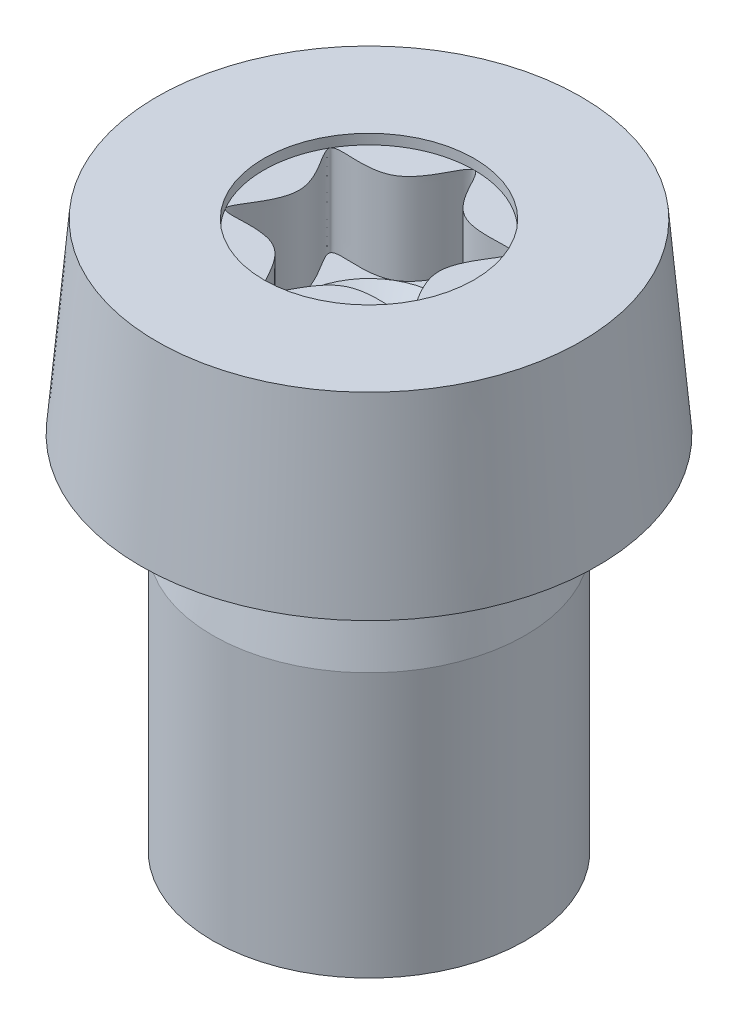
ISO-10303-21;
HEADER;
FILE_DESCRIPTION(('STEP AP214'),'2;1');
FILE_NAME('part.step','',(''),(''),'','','');
FILE_SCHEMA(('AUTOMOTIVE_DESIGN { 1 0 10303 214 1 1 1 1 }'));
ENDSEC;
DATA;
#1=APPLICATION_CONTEXT('core data for automotive mechanical design processes');
#2=APPLICATION_PROTOCOL_DEFINITION('international standard','automotive_design',2000,#1);
#3=PRODUCT_CONTEXT('',#1,'mechanical');
#4=PRODUCT('Part','Part','',(#3));
#5=PRODUCT_RELATED_PRODUCT_CATEGORY('part','',(#4));
#6=PRODUCT_DEFINITION_FORMATION('','',#4);
#7=PRODUCT_DEFINITION_CONTEXT('part definition',#1,'design');
#8=PRODUCT_DEFINITION('design','',#6,#7);
#9=PRODUCT_DEFINITION_SHAPE('','',#8);
#10=(LENGTH_UNIT() NAMED_UNIT(*) SI_UNIT(.MILLI.,.METRE.));
#11=(NAMED_UNIT(*) PLANE_ANGLE_UNIT() SI_UNIT($,.RADIAN.));
#12=(NAMED_UNIT(*) SI_UNIT($,.STERADIAN.) SOLID_ANGLE_UNIT());
#13=UNCERTAINTY_MEASURE_WITH_UNIT(LENGTH_MEASURE(1.E-05),#10,'distance_accuracy_value','');
#14=(GEOMETRIC_REPRESENTATION_CONTEXT(3) GLOBAL_UNCERTAINTY_ASSIGNED_CONTEXT((#13)) GLOBAL_UNIT_ASSIGNED_CONTEXT((#10,
#11,#12)) REPRESENTATION_CONTEXT('',''));
#15=CARTESIAN_POINT('',(0.,0.,0.));
#16=DIRECTION('',(0.,0.,1.));
#17=DIRECTION('',(1.,0.,0.));
#18=AXIS2_PLACEMENT_3D('',#15,#16,#17);
#19=CARTESIAN_POINT('',(0.,3.71,0.875));
#20=DIRECTION('',(0.,1.,0.));
#21=DIRECTION('',(0.,0.,1.));
#22=AXIS2_PLACEMENT_3D('',#19,#20,#21);
#23=PLANE('',#22);
#24=CARTESIAN_POINT('',(0.,3.71,-0.875));
#25=CARTESIAN_POINT('',(0.0629068366700436,3.71,-0.874999999999998));
#26=CARTESIAN_POINT('',(0.188720510010129,3.71,-0.326873511767858));
#27=CARTESIAN_POINT('',(0.995117959959479,3.71,-0.574531622058037));
#28=CARTESIAN_POINT('',(0.377441020020261,3.71,0.));
#29=CARTESIAN_POINT('',(0.995117959959478,3.71,0.574531622058034));
#30=CARTESIAN_POINT('',(0.188720510010133,3.71,0.326873511767864));
#31=CARTESIAN_POINT('',(0.,3.71,1.14906324411607));
#32=CARTESIAN_POINT('',(-0.188720510010137,3.71,0.326873511767868));
#33=CARTESIAN_POINT('',(-0.995117959959476,3.71,0.574531622058033));
#34=CARTESIAN_POINT('',(-0.377441020020261,3.71,0.));
#35=CARTESIAN_POINT('',(-0.995117959959476,3.71,-0.574531622058033));
#36=CARTESIAN_POINT('',(-0.188720510010135,3.71,-0.326873511767861));
#37=CARTESIAN_POINT('',(-0.0629068366700447,3.71,-0.875000000000002));
#38=CARTESIAN_POINT('',(0.,3.71,-0.875));
#39=B_SPLINE_CURVE_WITH_KNOTS('',3,(#24,#25,#26,#27,#28,#29,#30,#31,#32,#33,#34,#35,#36,#37,
#38),.UNSPECIFIED.,.T.,.F.,(4,1,1,1,1,1,1,1,1,1,1,1,4),(0.,0.0833333333333329,0.166666666666667,
0.25,0.333333333333334,0.416666666666668,0.5,0.583333333333333,0.666666666666666,0.75,
0.833333333333333,0.916666666666666,1.),.UNSPECIFIED.);
#40=CARTESIAN_POINT('',(0.291666666666665,3.71,-0.505181485540923));
#41=VERTEX_POINT('',#40);
#42=CARTESIAN_POINT('',(0.583333333333333,3.71,0.));
#43=VERTEX_POINT('',#42);
#44=EDGE_CURVE('E137',#41,#43,#39,.T.);
#45=ORIENTED_EDGE('',*,*,#44,.F.);
#46=CARTESIAN_POINT('',(0.,3.71,0.));
#47=DIRECTION('',(0.,-1.,0.));
#48=DIRECTION('',(0.,0.,-1.));
#49=AXIS2_PLACEMENT_3D('',#46,#47,#48);
#50=CIRCLE('',#49,0.583333333333333);
#51=EDGE_CURVE('E47',#41,#43,#50,.T.);
#52=ORIENTED_EDGE('',*,*,#51,.T.);
#53=EDGE_LOOP('',(#45,#52));
#54=FACE_BOUND('',#53,.T.);
#55=ADVANCED_FACE('F34',(#54),#23,.T.);
#56=CARTESIAN_POINT('',(0.291666666666666,3.71,0.505181485540923));
#57=VERTEX_POINT('',#56);
#58=EDGE_CURVE('E152',#43,#57,#39,.T.);
#59=ORIENTED_EDGE('',*,*,#58,.F.);
#60=EDGE_CURVE('E11',#43,#57,#50,.T.);
#61=ORIENTED_EDGE('',*,*,#60,.T.);
#62=EDGE_LOOP('',(#59,#61));
#63=FACE_BOUND('',#62,.T.);
#64=ADVANCED_FACE('F104',(#63),#23,.T.);
#65=CARTESIAN_POINT('',(-0.291666666666667,3.71,0.505181485540923));
#66=VERTEX_POINT('',#65);
#67=EDGE_CURVE('E145',#57,#66,#39,.T.);
#68=ORIENTED_EDGE('',*,*,#67,.F.);
#69=EDGE_CURVE('E45',#57,#66,#50,.T.);
#70=ORIENTED_EDGE('',*,*,#69,.T.);
#71=EDGE_LOOP('',(#68,#70));
#72=FACE_BOUND('',#71,.T.);
#73=ADVANCED_FACE('F111',(#72),#23,.T.);
#74=CARTESIAN_POINT('',(-0.583333333333333,3.71,0.));
#75=VERTEX_POINT('',#74);
#76=EDGE_CURVE('E143',#66,#75,#39,.T.);
#77=ORIENTED_EDGE('',*,*,#76,.F.);
#78=EDGE_CURVE('E386',#66,#75,#50,.T.);
#79=ORIENTED_EDGE('',*,*,#78,.T.);
#80=EDGE_LOOP('',(#77,#79));
#81=FACE_BOUND('',#80,.T.);
#82=ADVANCED_FACE('F126',(#81),#23,.T.);
#83=CARTESIAN_POINT('',(-0.291666666666668,3.71,-0.505181485540922));
#84=VERTEX_POINT('',#83);
#85=EDGE_CURVE('E134',#75,#84,#39,.T.);
#86=ORIENTED_EDGE('',*,*,#85,.F.);
#87=EDGE_CURVE('E203',#75,#84,#50,.T.);
#88=ORIENTED_EDGE('',*,*,#87,.T.);
#89=EDGE_LOOP('',(#86,#88));
#90=FACE_BOUND('',#89,.T.);
#91=ADVANCED_FACE('F117',(#90),#23,.T.);
#92=EDGE_CURVE('E130',#84,#41,#39,.T.);
#93=ORIENTED_EDGE('',*,*,#92,.F.);
#94=EDGE_CURVE('E132',#84,#41,#50,.T.);
#95=ORIENTED_EDGE('',*,*,#94,.T.);
#96=EDGE_LOOP('',(#93,#95));
#97=FACE_BOUND('',#96,.T.);
#98=ADVANCED_FACE('F107',(#97),#23,.T.);
#99=CARTESIAN_POINT('',(0.,4.55,0.));
#100=DIRECTION('',(0.,1.,0.));
#101=DIRECTION('',(0.,0.,1.));
#102=AXIS2_PLACEMENT_3D('',#99,#100,#101);
#103=PLANE('',#102);
#104=CARTESIAN_POINT('',(0.,4.55,0.));
#105=DIRECTION('',(0.,1.,0.));
#106=DIRECTION('',(0.,0.,1.));
#107=AXIS2_PLACEMENT_3D('',#104,#105,#106);
#108=CIRCLE('',#107,0.875);
#109=CARTESIAN_POINT('',(0.,4.55,0.875));
#110=VERTEX_POINT('',#109);
#111=EDGE_CURVE('E153',#110,#110,#108,.T.);
#112=ORIENTED_EDGE('',*,*,#111,.F.);
#113=EDGE_LOOP('',(#112));
#114=FACE_BOUND('',#113,.T.);
#115=CARTESIAN_POINT('',(0.,4.55,0.));
#116=DIRECTION('',(0.,-1.,0.));
#117=DIRECTION('',(0.,0.,-1.));
#118=AXIS2_PLACEMENT_3D('',#115,#116,#117);
#119=CIRCLE('',#118,1.76439257153483);
#120=CARTESIAN_POINT('',(0.,4.55,-1.76439257153483));
#121=VERTEX_POINT('',#120);
#122=EDGE_CURVE('E151',#121,#121,#119,.T.);
#123=ORIENTED_EDGE('',*,*,#122,.F.);
#124=EDGE_LOOP('',(#123));
#125=FACE_BOUND('',#124,.T.);
#126=ADVANCED_FACE('F116',(#114,#125),#103,.T.);
#127=CARTESIAN_POINT('',(1.3,0.,0.));
#128=DIRECTION('',(0.,-1.,0.));
#129=DIRECTION('',(0.,0.,-1.));
#130=AXIS2_PLACEMENT_3D('',#127,#128,#129);
#131=PLANE('',#130);
#132=CARTESIAN_POINT('',(0.,0.,0.));
#133=DIRECTION('',(0.,-1.,0.));
#134=DIRECTION('',(0.,0.,-1.));
#135=AXIS2_PLACEMENT_3D('',#132,#133,#134);
#136=CIRCLE('',#135,1.3);
#137=CARTESIAN_POINT('',(0.,0.,-1.3));
#138=VERTEX_POINT('',#137);
#139=EDGE_CURVE('E181',#138,#138,#136,.T.);
#140=ORIENTED_EDGE('',*,*,#139,.T.);
#141=EDGE_LOOP('',(#140));
#142=FACE_BOUND('',#141,.T.);
#143=ADVANCED_FACE('F123',(#142),#131,.T.);
#144=CARTESIAN_POINT('',(0.,0.,0.));
#145=DIRECTION('',(0.,-1.,0.));
#146=DIRECTION('',(0.,0.,-1.));
#147=AXIS2_PLACEMENT_3D('',#144,#145,#146);
#148=CYLINDRICAL_SURFACE('',#147,1.3);
#149=CARTESIAN_POINT('',(0.,2.2,0.));
#150=DIRECTION('',(0.,-1.,0.));
#151=DIRECTION('',(0.,0.,-1.));
#152=AXIS2_PLACEMENT_3D('',#149,#150,#151);
#153=CIRCLE('',#152,1.3);
#154=CARTESIAN_POINT('',(0.,2.2,-1.3));
#155=VERTEX_POINT('',#154);
#156=EDGE_CURVE('E184',#155,#155,#153,.T.);
#157=ORIENTED_EDGE('',*,*,#156,.T.);
#158=EDGE_LOOP('',(#157));
#159=FACE_BOUND('',#158,.T.);
#160=ORIENTED_EDGE('',*,*,#139,.F.);
#161=EDGE_LOOP('',(#160));
#162=FACE_BOUND('',#161,.T.);
#163=ADVANCED_FACE('F171',(#159,#162),#148,.T.);
#164=CARTESIAN_POINT('',(0.,2.2,0.));
#165=DIRECTION('',(0.,-1.,0.));
#166=DIRECTION('',(0.,0.,-1.));
#167=AXIS2_PLACEMENT_3D('',#164,#165,#166);
#168=CONICAL_SURFACE('',#167,1.3,0.197395559849881);
#169=CARTESIAN_POINT('',(0.,2.88038838648618,0.));
#170=DIRECTION('',(0.,-1.,0.));
#171=DIRECTION('',(0.,0.,-1.));
#172=AXIS2_PLACEMENT_3D('',#169,#170,#171);
#173=CIRCLE('',#172,1.16392232270276);
#174=CARTESIAN_POINT('',(0.,2.88038838648618,-1.16392232270276));
#175=VERTEX_POINT('',#174);
#176=EDGE_CURVE('E183',#175,#175,#173,.T.);
#177=ORIENTED_EDGE('',*,*,#176,.T.);
#178=EDGE_LOOP('',(#177));
#179=FACE_BOUND('',#178,.T.);
#180=ORIENTED_EDGE('',*,*,#156,.F.);
#181=EDGE_LOOP('',(#180));
#182=FACE_BOUND('',#181,.T.);
#183=ADVANCED_FACE('F167',(#179,#182),#168,.T.);
#184=CARTESIAN_POINT('',(1.9,3.,0.));
#185=DIRECTION('',(0.,-1.,0.));
#186=DIRECTION('',(0.,0.,-1.));
#187=AXIS2_PLACEMENT_3D('',#184,#185,#186);
#188=PLANE('',#187);
#189=CARTESIAN_POINT('',(0.,3.,0.));
#190=DIRECTION('',(0.,-1.,0.));
#191=DIRECTION('',(0.,0.,-1.));
#192=AXIS2_PLACEMENT_3D('',#189,#190,#191);
#193=CIRCLE('',#192,1.26198039027186);
#194=CARTESIAN_POINT('',(0.,3.,-1.26198039027186));
#195=VERTEX_POINT('',#194);
#196=EDGE_CURVE('E187',#195,#195,#193,.F.);
#197=ORIENTED_EDGE('',*,*,#196,.T.);
#198=EDGE_LOOP('',(#197));
#199=FACE_BOUND('',#198,.T.);
#200=CARTESIAN_POINT('',(0.,3.,0.));
#201=DIRECTION('',(0.,-1.,0.));
#202=DIRECTION('',(0.,0.,-1.));
#203=AXIS2_PLACEMENT_3D('',#200,#201,#202);
#204=CIRCLE('',#203,1.9);
#205=CARTESIAN_POINT('',(0.,3.,-1.9));
#206=VERTEX_POINT('',#205);
#207=EDGE_CURVE('E190',#206,#206,#204,.T.);
#208=ORIENTED_EDGE('',*,*,#207,.T.);
#209=EDGE_LOOP('',(#208));
#210=FACE_BOUND('',#209,.T.);
#211=ADVANCED_FACE('F163',(#199,#210),#188,.T.);
#212=CARTESIAN_POINT('',(0.,3.,0.));
#213=DIRECTION('',(0.,-1.,0.));
#214=DIRECTION('',(0.,0.,-1.));
#215=AXIS2_PLACEMENT_3D('',#212,#213,#214);
#216=CONICAL_SURFACE('',#215,1.9,0.08726646259971);
#217=ORIENTED_EDGE('',*,*,#122,.T.);
#218=EDGE_LOOP('',(#217));
#219=FACE_BOUND('',#218,.T.);
#220=ORIENTED_EDGE('',*,*,#207,.F.);
#221=EDGE_LOOP('',(#220));
#222=FACE_BOUND('',#221,.T.);
#223=ADVANCED_FACE('F160',(#219,#222),#216,.T.);
#224=CARTESIAN_POINT('',(0.,2.9,0.));
#225=DIRECTION('',(0.,-1.,0.));
#226=DIRECTION('',(0.,0.,-1.));
#227=AXIS2_PLACEMENT_3D('',#224,#225,#226);
#228=TOROIDAL_SURFACE('',#227,1.26198039027186,0.1);
#229=ORIENTED_EDGE('',*,*,#196,.F.);
#230=EDGE_LOOP('',(#229));
#231=FACE_BOUND('',#230,.T.);
#232=ORIENTED_EDGE('',*,*,#176,.F.);
#233=EDGE_LOOP('',(#232));
#234=FACE_BOUND('',#233,.T.);
#235=ADVANCED_FACE('F36',(#231,#234),#228,.F.);
#236=CARTESIAN_POINT('',(0.,4.466,0.));
#237=DIRECTION('',(0.,1.,0.));
#238=DIRECTION('',(0.,0.,1.));
#239=AXIS2_PLACEMENT_3D('',#236,#237,#238);
#240=CYLINDRICAL_SURFACE('',#239,0.875);
#241=ORIENTED_EDGE('',*,*,#111,.T.);
#242=EDGE_LOOP('',(#241));
#243=FACE_BOUND('',#242,.T.);
#244=CARTESIAN_POINT('',(0.,4.466,0.));
#245=DIRECTION('',(0.,1.,0.));
#246=DIRECTION('',(0.,0.,1.));
#247=AXIS2_PLACEMENT_3D('',#244,#245,#246);
#248=CIRCLE('',#247,0.875);
#249=CARTESIAN_POINT('',(0.757772228311384,4.466,0.4375));
#250=VERTEX_POINT('',#249);
#251=CARTESIAN_POINT('',(0.757772228311384,4.466,-0.4375));
#252=VERTEX_POINT('',#251);
#253=EDGE_CURVE('E223',#250,#252,#248,.T.);
#254=ORIENTED_EDGE('',*,*,#253,.F.);
#255=CARTESIAN_POINT('',(0.,4.466,0.875));
#256=VERTEX_POINT('',#255);
#257=EDGE_CURVE('E135',#256,#250,#248,.T.);
#258=ORIENTED_EDGE('',*,*,#257,.F.);
#259=CARTESIAN_POINT('',(-0.757772228311383,4.466,0.437500000000001));
#260=VERTEX_POINT('',#259);
#261=EDGE_CURVE('E214',#260,#256,#248,.T.);
#262=ORIENTED_EDGE('',*,*,#261,.F.);
#263=CARTESIAN_POINT('',(-0.757772228311384,4.466,-0.4375));
#264=VERTEX_POINT('',#263);
#265=EDGE_CURVE('E219',#264,#260,#248,.T.);
#266=ORIENTED_EDGE('',*,*,#265,.F.);
#267=CARTESIAN_POINT('',(0.,4.466,-0.875));
#268=VERTEX_POINT('',#267);
#269=EDGE_CURVE('E263',#268,#264,#248,.T.);
#270=ORIENTED_EDGE('',*,*,#269,.F.);
#271=EDGE_CURVE('E60',#252,#268,#248,.T.);
#272=ORIENTED_EDGE('',*,*,#271,.F.);
#273=EDGE_LOOP('',(#254,#258,#262,#266,#270,#272));
#274=FACE_BOUND('',#273,.T.);
#275=ADVANCED_FACE('F221',(#243,#274),#240,.F.);
#276=CARTESIAN_POINT('',(0.,4.466,0.));
#277=DIRECTION('',(0.,1.,0.));
#278=DIRECTION('',(0.,0.,1.));
#279=AXIS2_PLACEMENT_3D('',#276,#277,#278);
#280=PLANE('',#279);
#281=ORIENTED_EDGE('',*,*,#269,.T.);
#282=CARTESIAN_POINT('',(0.,4.466,-0.875));
#283=CARTESIAN_POINT('',(0.0629068366700436,4.466,-0.874999999999998));
#284=CARTESIAN_POINT('',(0.188720510010129,4.466,-0.326873511767858));
#285=CARTESIAN_POINT('',(0.995117959959479,4.466,-0.574531622058037));
#286=CARTESIAN_POINT('',(0.377441020020261,4.466,0.));
#287=CARTESIAN_POINT('',(0.995117959959478,4.466,0.574531622058034));
#288=CARTESIAN_POINT('',(0.188720510010133,4.466,0.326873511767864));
#289=CARTESIAN_POINT('',(0.,4.466,1.14906324411607));
#290=CARTESIAN_POINT('',(-0.188720510010137,4.466,0.326873511767868));
#291=CARTESIAN_POINT('',(-0.995117959959476,4.466,0.574531622058033));
#292=CARTESIAN_POINT('',(-0.377441020020261,4.466,0.));
#293=CARTESIAN_POINT('',(-0.995117959959476,4.466,-0.574531622058033));
#294=CARTESIAN_POINT('',(-0.188720510010135,4.466,-0.326873511767861));
#295=CARTESIAN_POINT('',(-0.0629068366700447,4.466,-0.875000000000002));
#296=CARTESIAN_POINT('',(0.,4.466,-0.875));
#297=B_SPLINE_CURVE_WITH_KNOTS('',3,(#282,#283,#284,#285,#286,#287,#288,#289,#290,#291,#292,
#293,#294,#295,#296),.UNSPECIFIED.,.T.,.F.,(4,1,1,1,1,1,1,1,1,1,1,1,4),(0.,0.0833333333333329,
0.166666666666667,0.25,0.333333333333334,0.416666666666668,0.5,0.583333333333333,
0.666666666666666,0.75,0.833333333333333,0.916666666666666,1.),.UNSPECIFIED.);
#298=EDGE_CURVE('E196',#268,#264,#297,.F.);
#299=ORIENTED_EDGE('',*,*,#298,.F.);
#300=EDGE_LOOP('',(#281,#299));
#301=FACE_BOUND('',#300,.T.);
#302=ADVANCED_FACE('F236',(#301),#280,.T.);
#303=ORIENTED_EDGE('',*,*,#265,.T.);
#304=EDGE_CURVE('E200',#264,#260,#297,.F.);
#305=ORIENTED_EDGE('',*,*,#304,.F.);
#306=EDGE_LOOP('',(#303,#305));
#307=FACE_BOUND('',#306,.T.);
#308=ADVANCED_FACE('F241',(#307),#280,.T.);
#309=ORIENTED_EDGE('',*,*,#261,.T.);
#310=EDGE_CURVE('E204',#260,#256,#297,.F.);
#311=ORIENTED_EDGE('',*,*,#310,.F.);
#312=EDGE_LOOP('',(#309,#311));
#313=FACE_BOUND('',#312,.T.);
#314=ADVANCED_FACE('F215',(#313),#280,.T.);
#315=ORIENTED_EDGE('',*,*,#257,.T.);
#316=EDGE_CURVE('E199',#256,#250,#297,.F.);
#317=ORIENTED_EDGE('',*,*,#316,.F.);
#318=EDGE_LOOP('',(#315,#317));
#319=FACE_BOUND('',#318,.T.);
#320=ADVANCED_FACE('F210',(#319),#280,.T.);
#321=ORIENTED_EDGE('',*,*,#253,.T.);
#322=EDGE_CURVE('E195',#250,#252,#297,.F.);
#323=ORIENTED_EDGE('',*,*,#322,.F.);
#324=EDGE_LOOP('',(#321,#323));
#325=FACE_BOUND('',#324,.T.);
#326=ADVANCED_FACE('F245',(#325),#280,.T.);
#327=ORIENTED_EDGE('',*,*,#271,.T.);
#328=EDGE_CURVE('E38',#252,#268,#297,.F.);
#329=ORIENTED_EDGE('',*,*,#328,.F.);
#330=EDGE_LOOP('',(#327,#329));
#331=FACE_BOUND('',#330,.T.);
#332=ADVANCED_FACE('F99',(#331),#280,.T.);
#333=DIRECTION('',(0.,1.,0.));
#334=VECTOR('',#333,1.);
#335=SURFACE_OF_LINEAR_EXTRUSION('',#39,#334);
#336=ORIENTED_EDGE('',*,*,#44,.T.);
#337=ORIENTED_EDGE('',*,*,#58,.T.);
#338=ORIENTED_EDGE('',*,*,#67,.T.);
#339=ORIENTED_EDGE('',*,*,#76,.T.);
#340=ORIENTED_EDGE('',*,*,#85,.T.);
#341=ORIENTED_EDGE('',*,*,#92,.T.);
#342=EDGE_LOOP('',(#336,#337,#338,#339,#340,#341));
#343=FACE_BOUND('',#342,.T.);
#344=ORIENTED_EDGE('',*,*,#328,.T.);
#345=ORIENTED_EDGE('',*,*,#298,.T.);
#346=ORIENTED_EDGE('',*,*,#304,.T.);
#347=ORIENTED_EDGE('',*,*,#310,.T.);
#348=ORIENTED_EDGE('',*,*,#316,.T.);
#349=ORIENTED_EDGE('',*,*,#322,.T.);
#350=EDGE_LOOP('',(#344,#345,#346,#347,#348,#349));
#351=FACE_BOUND('',#350,.T.);
#352=ADVANCED_FACE('F94',(#343,#351),#335,.T.);
#353=CARTESIAN_POINT('',(0.,3.155,0.));
#354=DIRECTION('',(0.,1.,0.));
#355=DIRECTION('',(0.,0.,1.));
#356=AXIS2_PLACEMENT_3D('',#353,#354,#355);
#357=CONICAL_SURFACE('',#356,0.,0.810283215640652);
#358=ORIENTED_EDGE('',*,*,#51,.F.);
#359=ORIENTED_EDGE('',*,*,#94,.F.);
#360=ORIENTED_EDGE('',*,*,#87,.F.);
#361=ORIENTED_EDGE('',*,*,#78,.F.);
#362=ORIENTED_EDGE('',*,*,#69,.F.);
#363=ORIENTED_EDGE('',*,*,#60,.F.);
#364=EDGE_LOOP('',(#358,#359,#360,#361,#362,#363));
#365=FACE_BOUND('',#364,.T.);
#366=CARTESIAN_POINT('',(0.,3.155,0.));
#367=VERTEX_POINT('',#366);
#368=VERTEX_LOOP('',#367);
#369=FACE_BOUND('',#368,.T.);
#370=ADVANCED_FACE('F92',(#365,#369),#357,.F.);
#371=CLOSED_SHELL('',(#55,#64,#73,#82,#91,#98,#126,#143,#163,#183,#211,#223,#235,#275,#302,#308,
#314,#320,#326,#332,#352,#370));
#372=MANIFOLD_SOLID_BREP('B2',#371);
#373=ADVANCED_BREP_SHAPE_REPRESENTATION('',(#18,#372),#14);
#374=SHAPE_DEFINITION_REPRESENTATION(#9,#373);
ENDSEC;
END-ISO-10303-21;
